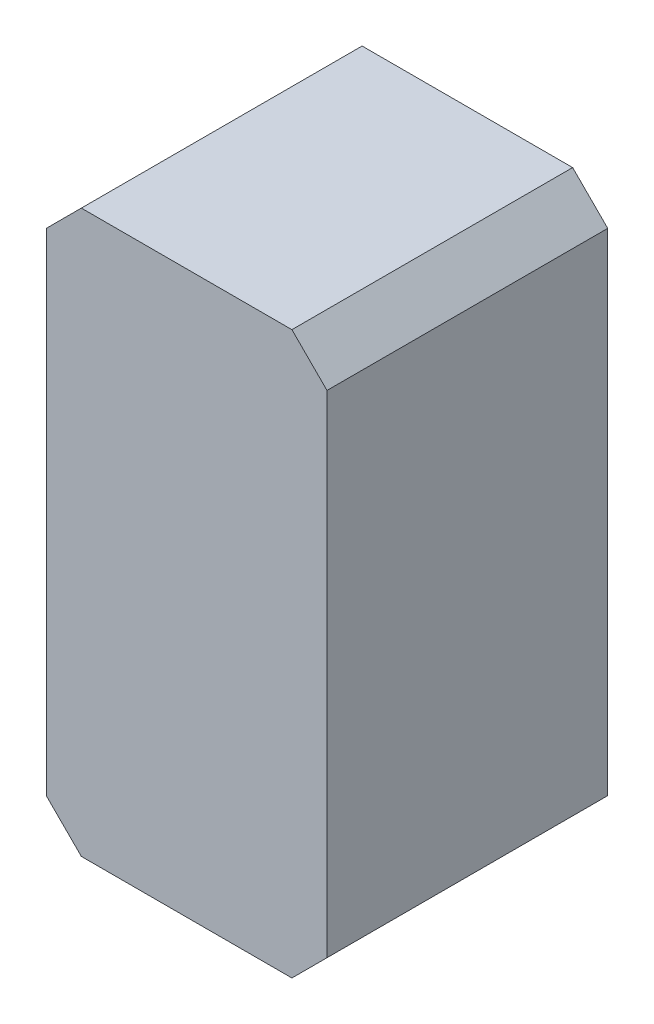
ISO-10303-21;
HEADER;
FILE_DESCRIPTION(('STEP AP214'),'2;1');
FILE_NAME('part.step','',(''),(''),'','','');
FILE_SCHEMA(('AUTOMOTIVE_DESIGN { 1 0 10303 214 1 1 1 1 }'));
ENDSEC;
DATA;
#1=APPLICATION_CONTEXT('core data for automotive mechanical design processes');
#2=APPLICATION_PROTOCOL_DEFINITION('international standard','automotive_design',2000,#1);
#3=PRODUCT_CONTEXT('',#1,'mechanical');
#4=PRODUCT('Part','Part','',(#3));
#5=PRODUCT_RELATED_PRODUCT_CATEGORY('part','',(#4));
#6=PRODUCT_DEFINITION_FORMATION('','',#4);
#7=PRODUCT_DEFINITION_CONTEXT('part definition',#1,'design');
#8=PRODUCT_DEFINITION('design','',#6,#7);
#9=PRODUCT_DEFINITION_SHAPE('','',#8);
#10=(LENGTH_UNIT() NAMED_UNIT(*) SI_UNIT(.MILLI.,.METRE.));
#11=(NAMED_UNIT(*) PLANE_ANGLE_UNIT() SI_UNIT($,.RADIAN.));
#12=(NAMED_UNIT(*) SI_UNIT($,.STERADIAN.) SOLID_ANGLE_UNIT());
#13=UNCERTAINTY_MEASURE_WITH_UNIT(LENGTH_MEASURE(1.E-05),#10,'distance_accuracy_value','');
#14=(GEOMETRIC_REPRESENTATION_CONTEXT(3) GLOBAL_UNCERTAINTY_ASSIGNED_CONTEXT((#13)) GLOBAL_UNIT_ASSIGNED_CONTEXT((#10,
#11,#12)) REPRESENTATION_CONTEXT('',''));
#15=CARTESIAN_POINT('',(0.,0.,0.));
#16=DIRECTION('',(0.,0.,1.));
#17=DIRECTION('',(1.,0.,0.));
#18=AXIS2_PLACEMENT_3D('',#15,#16,#17);
#19=CARTESIAN_POINT('',(2.,4.,4.));
#20=DIRECTION('',(-1.,0.,0.));
#21=DIRECTION('',(0.,-1.,0.));
#22=AXIS2_PLACEMENT_3D('',#19,#20,#21);
#23=PLANE('',#22);
#24=DIRECTION('',(0.,1.,0.));
#25=VECTOR('',#24,1.);
#26=CARTESIAN_POINT('',(2.,4.,4.));
#27=LINE('',#26,#25);
#28=CARTESIAN_POINT('',(2.,-3.5,4.));
#29=VERTEX_POINT('',#28);
#30=CARTESIAN_POINT('',(2.,3.5,4.));
#31=VERTEX_POINT('',#30);
#32=EDGE_CURVE('E126',#29,#31,#27,.T.);
#33=ORIENTED_EDGE('',*,*,#32,.F.);
#34=DIRECTION('',(0.,0.,-1.));
#35=VECTOR('',#34,1.);
#36=CARTESIAN_POINT('',(2.,-3.5,4.));
#37=LINE('',#36,#35);
#38=CARTESIAN_POINT('',(2.,-3.5,0.));
#39=VERTEX_POINT('',#38);
#40=EDGE_CURVE('E152',#29,#39,#37,.T.);
#41=ORIENTED_EDGE('',*,*,#40,.T.);
#42=DIRECTION('',(0.,1.,0.));
#43=VECTOR('',#42,1.);
#44=CARTESIAN_POINT('',(2.,4.,0.));
#45=LINE('',#44,#43);
#46=CARTESIAN_POINT('',(2.,3.5,0.));
#47=VERTEX_POINT('',#46);
#48=EDGE_CURVE('E160',#39,#47,#45,.T.);
#49=ORIENTED_EDGE('',*,*,#48,.T.);
#50=DIRECTION('',(0.,0.,1.));
#51=VECTOR('',#50,1.);
#52=CARTESIAN_POINT('',(2.,3.5,4.));
#53=LINE('',#52,#51);
#54=EDGE_CURVE('E150',#47,#31,#53,.T.);
#55=ORIENTED_EDGE('',*,*,#54,.T.);
#56=EDGE_LOOP('',(#33,#41,#49,#55));
#57=FACE_BOUND('',#56,.T.);
#58=ADVANCED_FACE('F34',(#57),#23,.F.);
#59=CARTESIAN_POINT('',(-2.,4.,4.));
#60=DIRECTION('',(0.,-1.,0.));
#61=DIRECTION('',(0.,0.,-1.));
#62=AXIS2_PLACEMENT_3D('',#59,#60,#61);
#63=PLANE('',#62);
#64=DIRECTION('',(-1.,0.,0.));
#65=VECTOR('',#64,1.);
#66=CARTESIAN_POINT('',(-2.,4.,0.));
#67=LINE('',#66,#65);
#68=CARTESIAN_POINT('',(1.5,4.,0.));
#69=VERTEX_POINT('',#68);
#70=CARTESIAN_POINT('',(-1.5,4.,0.));
#71=VERTEX_POINT('',#70);
#72=EDGE_CURVE('E131',#69,#71,#67,.T.);
#73=ORIENTED_EDGE('',*,*,#72,.T.);
#74=DIRECTION('',(0.,0.,1.));
#75=VECTOR('',#74,1.);
#76=CARTESIAN_POINT('',(-1.5,4.,4.));
#77=LINE('',#76,#75);
#78=CARTESIAN_POINT('',(-1.5,4.,4.));
#79=VERTEX_POINT('',#78);
#80=EDGE_CURVE('E11',#71,#79,#77,.T.);
#81=ORIENTED_EDGE('',*,*,#80,.T.);
#82=DIRECTION('',(-1.,0.,0.));
#83=VECTOR('',#82,1.);
#84=CARTESIAN_POINT('',(-2.,4.,4.));
#85=LINE('',#84,#83);
#86=CARTESIAN_POINT('',(1.5,4.,4.));
#87=VERTEX_POINT('',#86);
#88=EDGE_CURVE('E129',#87,#79,#85,.T.);
#89=ORIENTED_EDGE('',*,*,#88,.F.);
#90=DIRECTION('',(0.,0.,-1.));
#91=VECTOR('',#90,1.);
#92=CARTESIAN_POINT('',(1.5,4.,4.));
#93=LINE('',#92,#91);
#94=EDGE_CURVE('E43',#87,#69,#93,.T.);
#95=ORIENTED_EDGE('',*,*,#94,.T.);
#96=EDGE_LOOP('',(#73,#81,#89,#95));
#97=FACE_BOUND('',#96,.T.);
#98=ADVANCED_FACE('F157',(#97),#63,.F.);
#99=CARTESIAN_POINT('',(-2.,4.,4.));
#100=DIRECTION('',(1.,0.,0.));
#101=DIRECTION('',(0.,1.,0.));
#102=AXIS2_PLACEMENT_3D('',#99,#100,#101);
#103=PLANE('',#102);
#104=DIRECTION('',(0.,-1.,0.));
#105=VECTOR('',#104,1.);
#106=CARTESIAN_POINT('',(-2.,4.,0.));
#107=LINE('',#106,#105);
#108=CARTESIAN_POINT('',(-2.,3.5,0.));
#109=VERTEX_POINT('',#108);
#110=CARTESIAN_POINT('',(-2.,-3.5,0.));
#111=VERTEX_POINT('',#110);
#112=EDGE_CURVE('E127',#109,#111,#107,.T.);
#113=ORIENTED_EDGE('',*,*,#112,.T.);
#114=DIRECTION('',(0.,0.,1.));
#115=VECTOR('',#114,1.);
#116=CARTESIAN_POINT('',(-2.,-3.5,4.));
#117=LINE('',#116,#115);
#118=CARTESIAN_POINT('',(-2.,-3.5,4.));
#119=VERTEX_POINT('',#118);
#120=EDGE_CURVE('E105',#111,#119,#117,.T.);
#121=ORIENTED_EDGE('',*,*,#120,.T.);
#122=DIRECTION('',(0.,-1.,0.));
#123=VECTOR('',#122,1.);
#124=CARTESIAN_POINT('',(-2.,4.,4.));
#125=LINE('',#124,#123);
#126=CARTESIAN_POINT('',(-2.,3.5,4.));
#127=VERTEX_POINT('',#126);
#128=EDGE_CURVE('E164',#127,#119,#125,.T.);
#129=ORIENTED_EDGE('',*,*,#128,.F.);
#130=DIRECTION('',(0.,0.,-1.));
#131=VECTOR('',#130,1.);
#132=CARTESIAN_POINT('',(-2.,3.5,4.));
#133=LINE('',#132,#131);
#134=EDGE_CURVE('E110',#127,#109,#133,.T.);
#135=ORIENTED_EDGE('',*,*,#134,.T.);
#136=EDGE_LOOP('',(#113,#121,#129,#135));
#137=FACE_BOUND('',#136,.T.);
#138=ADVANCED_FACE('F174',(#137),#103,.F.);
#139=CARTESIAN_POINT('',(-2.,-4.,4.));
#140=DIRECTION('',(0.,1.,0.));
#141=DIRECTION('',(0.,0.,1.));
#142=AXIS2_PLACEMENT_3D('',#139,#140,#141);
#143=PLANE('',#142);
#144=DIRECTION('',(1.,0.,0.));
#145=VECTOR('',#144,1.);
#146=CARTESIAN_POINT('',(-2.,-4.,4.));
#147=LINE('',#146,#145);
#148=CARTESIAN_POINT('',(-1.5,-4.,4.));
#149=VERTEX_POINT('',#148);
#150=CARTESIAN_POINT('',(1.5,-4.,4.));
#151=VERTEX_POINT('',#150);
#152=EDGE_CURVE('E120',#149,#151,#147,.T.);
#153=ORIENTED_EDGE('',*,*,#152,.F.);
#154=DIRECTION('',(0.,0.,-1.));
#155=VECTOR('',#154,1.);
#156=CARTESIAN_POINT('',(-1.5,-4.,4.));
#157=LINE('',#156,#155);
#158=CARTESIAN_POINT('',(-1.5,-4.,0.));
#159=VERTEX_POINT('',#158);
#160=EDGE_CURVE('E104',#149,#159,#157,.T.);
#161=ORIENTED_EDGE('',*,*,#160,.T.);
#162=DIRECTION('',(1.,0.,0.));
#163=VECTOR('',#162,1.);
#164=CARTESIAN_POINT('',(-2.,-4.,0.));
#165=LINE('',#164,#163);
#166=CARTESIAN_POINT('',(1.5,-4.,0.));
#167=VERTEX_POINT('',#166);
#168=EDGE_CURVE('E117',#159,#167,#165,.T.);
#169=ORIENTED_EDGE('',*,*,#168,.T.);
#170=DIRECTION('',(0.,0.,1.));
#171=VECTOR('',#170,1.);
#172=CARTESIAN_POINT('',(1.5,-4.,4.));
#173=LINE('',#172,#171);
#174=EDGE_CURVE('E122',#167,#151,#173,.T.);
#175=ORIENTED_EDGE('',*,*,#174,.T.);
#176=EDGE_LOOP('',(#153,#161,#169,#175));
#177=FACE_BOUND('',#176,.T.);
#178=ADVANCED_FACE('F116',(#177),#143,.F.);
#179=CARTESIAN_POINT('',(0.,0.,4.));
#180=DIRECTION('',(0.,0.,1.));
#181=DIRECTION('',(1.,0.,0.));
#182=AXIS2_PLACEMENT_3D('',#179,#180,#181);
#183=PLANE('',#182);
#184=ORIENTED_EDGE('',*,*,#128,.T.);
#185=DIRECTION('',(-0.707106781186548,0.707106781186547,0.));
#186=VECTOR('',#185,1.);
#187=CARTESIAN_POINT('',(-2.75,-2.75,4.));
#188=LINE('',#187,#186);
#189=EDGE_CURVE('E148',#119,#149,#188,.F.);
#190=ORIENTED_EDGE('',*,*,#189,.T.);
#191=ORIENTED_EDGE('',*,*,#152,.T.);
#192=DIRECTION('',(-0.707106781186548,-0.707106781186548,0.));
#193=VECTOR('',#192,1.);
#194=CARTESIAN_POINT('',(2.75,-2.75,4.));
#195=LINE('',#194,#193);
#196=EDGE_CURVE('E146',#151,#29,#195,.F.);
#197=ORIENTED_EDGE('',*,*,#196,.T.);
#198=ORIENTED_EDGE('',*,*,#32,.T.);
#199=DIRECTION('',(0.707106781186548,-0.707106781186547,0.));
#200=VECTOR('',#199,1.);
#201=CARTESIAN_POINT('',(2.75,2.75,4.));
#202=LINE('',#201,#200);
#203=EDGE_CURVE('E55',#31,#87,#202,.F.);
#204=ORIENTED_EDGE('',*,*,#203,.T.);
#205=ORIENTED_EDGE('',*,*,#88,.T.);
#206=DIRECTION('',(0.707106781186548,0.707106781186548,0.));
#207=VECTOR('',#206,1.);
#208=CARTESIAN_POINT('',(-2.75,2.75,4.));
#209=LINE('',#208,#207);
#210=EDGE_CURVE('E144',#79,#127,#209,.F.);
#211=ORIENTED_EDGE('',*,*,#210,.T.);
#212=EDGE_LOOP('',(#184,#190,#191,#197,#198,#204,#205,#211));
#213=FACE_BOUND('',#212,.T.);
#214=ADVANCED_FACE('F168',(#213),#183,.T.);
#215=CARTESIAN_POINT('',(0.,0.,0.));
#216=DIRECTION('',(0.,0.,1.));
#217=DIRECTION('',(1.,0.,0.));
#218=AXIS2_PLACEMENT_3D('',#215,#216,#217);
#219=PLANE('',#218);
#220=ORIENTED_EDGE('',*,*,#168,.F.);
#221=DIRECTION('',(0.707106781186548,-0.707106781186547,0.));
#222=VECTOR('',#221,1.);
#223=CARTESIAN_POINT('',(-1.5,-4.,0.));
#224=LINE('',#223,#222);
#225=EDGE_CURVE('E100',#159,#111,#224,.F.);
#226=ORIENTED_EDGE('',*,*,#225,.T.);
#227=ORIENTED_EDGE('',*,*,#112,.F.);
#228=DIRECTION('',(-0.707106781186548,-0.707106781186548,0.));
#229=VECTOR('',#228,1.);
#230=CARTESIAN_POINT('',(-2.,3.5,0.));
#231=LINE('',#230,#229);
#232=EDGE_CURVE('E137',#109,#71,#231,.F.);
#233=ORIENTED_EDGE('',*,*,#232,.T.);
#234=ORIENTED_EDGE('',*,*,#72,.F.);
#235=DIRECTION('',(-0.707106781186548,0.707106781186547,0.));
#236=VECTOR('',#235,1.);
#237=CARTESIAN_POINT('',(1.5,4.,0.));
#238=LINE('',#237,#236);
#239=EDGE_CURVE('E121',#69,#47,#238,.F.);
#240=ORIENTED_EDGE('',*,*,#239,.T.);
#241=ORIENTED_EDGE('',*,*,#48,.F.);
#242=DIRECTION('',(0.707106781186548,0.707106781186548,0.));
#243=VECTOR('',#242,1.);
#244=CARTESIAN_POINT('',(2.,-3.5,0.));
#245=LINE('',#244,#243);
#246=EDGE_CURVE('E111',#39,#167,#245,.F.);
#247=ORIENTED_EDGE('',*,*,#246,.T.);
#248=EDGE_LOOP('',(#220,#226,#227,#233,#234,#240,#241,#247));
#249=FACE_BOUND('',#248,.T.);
#250=ADVANCED_FACE('F124',(#249),#219,.F.);
#251=CARTESIAN_POINT('',(-1.5,-4.,4.));
#252=DIRECTION('',(0.707106781186547,0.707106781186548,0.));
#253=DIRECTION('',(0.,0.,-1.));
#254=AXIS2_PLACEMENT_3D('',#251,#252,#253);
#255=PLANE('',#254);
#256=ORIENTED_EDGE('',*,*,#189,.F.);
#257=ORIENTED_EDGE('',*,*,#120,.F.);
#258=ORIENTED_EDGE('',*,*,#225,.F.);
#259=ORIENTED_EDGE('',*,*,#160,.F.);
#260=EDGE_LOOP('',(#256,#257,#258,#259));
#261=FACE_BOUND('',#260,.T.);
#262=ADVANCED_FACE('F103',(#261),#255,.F.);
#263=CARTESIAN_POINT('',(2.,-3.5,4.));
#264=DIRECTION('',(-0.707106781186548,0.707106781186548,0.));
#265=DIRECTION('',(0.,0.,-1.));
#266=AXIS2_PLACEMENT_3D('',#263,#264,#265);
#267=PLANE('',#266);
#268=ORIENTED_EDGE('',*,*,#196,.F.);
#269=ORIENTED_EDGE('',*,*,#174,.F.);
#270=ORIENTED_EDGE('',*,*,#246,.F.);
#271=ORIENTED_EDGE('',*,*,#40,.F.);
#272=EDGE_LOOP('',(#268,#269,#270,#271));
#273=FACE_BOUND('',#272,.T.);
#274=ADVANCED_FACE('F179',(#273),#267,.F.);
#275=CARTESIAN_POINT('',(-2.,3.5,4.));
#276=DIRECTION('',(0.707106781186548,-0.707106781186548,0.));
#277=DIRECTION('',(0.,0.,-1.));
#278=AXIS2_PLACEMENT_3D('',#275,#276,#277);
#279=PLANE('',#278);
#280=ORIENTED_EDGE('',*,*,#210,.F.);
#281=ORIENTED_EDGE('',*,*,#80,.F.);
#282=ORIENTED_EDGE('',*,*,#232,.F.);
#283=ORIENTED_EDGE('',*,*,#134,.F.);
#284=EDGE_LOOP('',(#280,#281,#282,#283));
#285=FACE_BOUND('',#284,.T.);
#286=ADVANCED_FACE('F172',(#285),#279,.F.);
#287=CARTESIAN_POINT('',(1.5,4.,4.));
#288=DIRECTION('',(-0.707106781186547,-0.707106781186548,0.));
#289=DIRECTION('',(0.,0.,-1.));
#290=AXIS2_PLACEMENT_3D('',#287,#288,#289);
#291=PLANE('',#290);
#292=ORIENTED_EDGE('',*,*,#203,.F.);
#293=ORIENTED_EDGE('',*,*,#54,.F.);
#294=ORIENTED_EDGE('',*,*,#239,.F.);
#295=ORIENTED_EDGE('',*,*,#94,.F.);
#296=EDGE_LOOP('',(#292,#293,#294,#295));
#297=FACE_BOUND('',#296,.T.);
#298=ADVANCED_FACE('F37',(#297),#291,.F.);
#299=CLOSED_SHELL('',(#58,#98,#138,#178,#214,#250,#262,#274,#286,#298));
#300=MANIFOLD_SOLID_BREP('B2',#299);
#301=ADVANCED_BREP_SHAPE_REPRESENTATION('',(#18,#300),#14);
#302=SHAPE_DEFINITION_REPRESENTATION(#9,#301);
ENDSEC;
END-ISO-10303-21;
